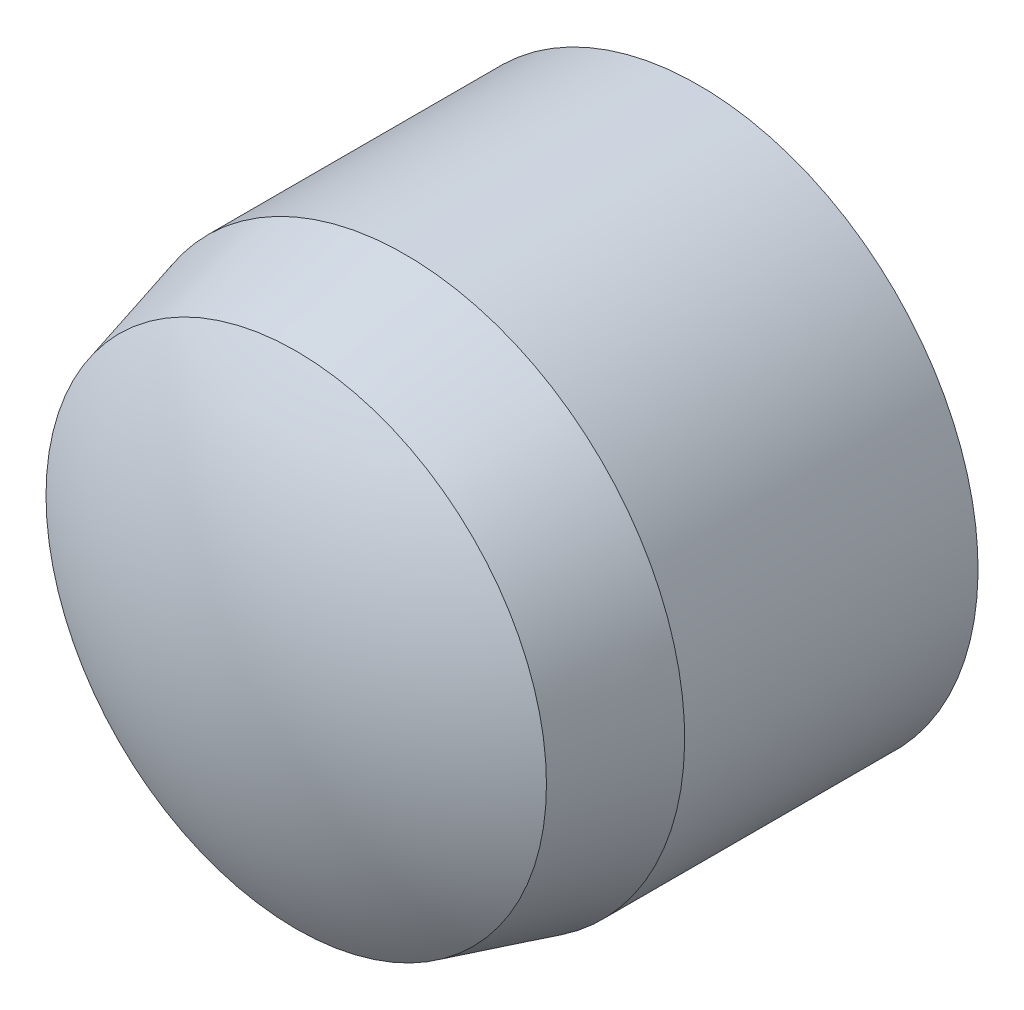
ISO-10303-21;
HEADER;
FILE_DESCRIPTION(('STEP AP214'),'2;1');
FILE_NAME('part.step','',(''),(''),'','','');
FILE_SCHEMA(('AUTOMOTIVE_DESIGN { 1 0 10303 214 1 1 1 1 }'));
ENDSEC;
DATA;
#1=APPLICATION_CONTEXT('core data for automotive mechanical design processes');
#2=APPLICATION_PROTOCOL_DEFINITION('international standard','automotive_design',2000,#1);
#3=PRODUCT_CONTEXT('',#1,'mechanical');
#4=PRODUCT('Part','Part','',(#3));
#5=PRODUCT_RELATED_PRODUCT_CATEGORY('part','',(#4));
#6=PRODUCT_DEFINITION_FORMATION('','',#4);
#7=PRODUCT_DEFINITION_CONTEXT('part definition',#1,'design');
#8=PRODUCT_DEFINITION('design','',#6,#7);
#9=PRODUCT_DEFINITION_SHAPE('','',#8);
#10=(LENGTH_UNIT() NAMED_UNIT(*) SI_UNIT(.MILLI.,.METRE.));
#11=(NAMED_UNIT(*) PLANE_ANGLE_UNIT() SI_UNIT($,.RADIAN.));
#12=(NAMED_UNIT(*) SI_UNIT($,.STERADIAN.) SOLID_ANGLE_UNIT());
#13=UNCERTAINTY_MEASURE_WITH_UNIT(LENGTH_MEASURE(1.E-05),#10,'distance_accuracy_value','');
#14=(GEOMETRIC_REPRESENTATION_CONTEXT(3) GLOBAL_UNCERTAINTY_ASSIGNED_CONTEXT((#13)) GLOBAL_UNIT_ASSIGNED_CONTEXT((#10,
#11,#12)) REPRESENTATION_CONTEXT('',''));
#15=CARTESIAN_POINT('',(0.,0.,0.));
#16=DIRECTION('',(0.,0.,1.));
#17=DIRECTION('',(1.,0.,0.));
#18=AXIS2_PLACEMENT_3D('',#15,#16,#17);
#19=CARTESIAN_POINT('',(0.,0.,2.04166666666665));
#20=DIRECTION('',(0.,0.,1.));
#21=DIRECTION('',(0.,-1.,0.));
#22=AXIS2_PLACEMENT_3D('',#19,#20,#21);
#23=SPHERICAL_SURFACE('',#22,4.54166666666665);
#24=CARTESIAN_POINT('',(0.,0.,-1.75));
#25=DIRECTION('',(0.,0.,1.));
#26=DIRECTION('',(0.,-1.,0.));
#27=AXIS2_PLACEMENT_3D('',#24,#25,#26);
#28=CIRCLE('',#27,2.5);
#29=CARTESIAN_POINT('',(0.,-2.5,-1.75));
#30=VERTEX_POINT('',#29);
#31=EDGE_CURVE('E10',#30,#30,#28,.T.);
#32=ORIENTED_EDGE('',*,*,#31,.F.);
#33=EDGE_LOOP('',(#32));
#34=FACE_BOUND('',#33,.T.);
#35=ADVANCED_FACE('F30',(#34),#23,.T.);
#36=CARTESIAN_POINT('',(0.,0.,2.5));
#37=DIRECTION('',(0.,0.,1.));
#38=DIRECTION('',(0.,-1.,0.));
#39=AXIS2_PLACEMENT_3D('',#36,#37,#38);
#40=CYLINDRICAL_SURFACE('',#39,2.5);
#41=CARTESIAN_POINT('',(0.,0.,0.875));
#42=DIRECTION('',(0.,0.,1.));
#43=DIRECTION('',(0.,-1.,0.));
#44=AXIS2_PLACEMENT_3D('',#41,#42,#43);
#45=CIRCLE('',#44,2.5);
#46=CARTESIAN_POINT('',(0.,-2.5,0.874999999999999));
#47=VERTEX_POINT('',#46);
#48=EDGE_CURVE('E36',#47,#47,#45,.T.);
#49=ORIENTED_EDGE('',*,*,#48,.F.);
#50=EDGE_LOOP('',(#49));
#51=FACE_BOUND('',#50,.T.);
#52=ORIENTED_EDGE('',*,*,#31,.T.);
#53=EDGE_LOOP('',(#52));
#54=FACE_BOUND('',#53,.T.);
#55=ADVANCED_FACE('F51',(#51,#54),#40,.T.);
#56=CARTESIAN_POINT('',(0.,0.,0.875));
#57=DIRECTION('',(0.,0.,-1.));
#58=DIRECTION('',(0.,1.,0.));
#59=AXIS2_PLACEMENT_3D('',#56,#57,#58);
#60=CONICAL_SURFACE('',#59,2.5,0.26179938779915);
#61=CARTESIAN_POINT('',(0.,0.,1.85));
#62=DIRECTION('',(0.,0.,1.));
#63=DIRECTION('',(0.,-1.,0.));
#64=AXIS2_PLACEMENT_3D('',#61,#62,#63);
#65=CIRCLE('',#64,2.23874953737965);
#66=CARTESIAN_POINT('',(0.,-2.23874953737965,1.85));
#67=VERTEX_POINT('',#66);
#68=EDGE_CURVE('E40',#67,#67,#65,.T.);
#69=ORIENTED_EDGE('',*,*,#68,.F.);
#70=EDGE_LOOP('',(#69));
#71=FACE_BOUND('',#70,.T.);
#72=ORIENTED_EDGE('',*,*,#48,.T.);
#73=EDGE_LOOP('',(#72));
#74=FACE_BOUND('',#73,.T.);
#75=ADVANCED_FACE('F49',(#71,#74),#60,.T.);
#76=CARTESIAN_POINT('',(0.,0.,-1.68038422393663));
#77=DIRECTION('',(0.,0.,1.));
#78=DIRECTION('',(0.,1.,0.));
#79=AXIS2_PLACEMENT_3D('',#76,#77,#78);
#80=SPHERICAL_SURFACE('',#79,4.18038422393663);
#81=ORIENTED_EDGE('',*,*,#68,.T.);
#82=EDGE_LOOP('',(#81));
#83=FACE_BOUND('',#82,.T.);
#84=ADVANCED_FACE('F47',(#83),#80,.T.);
#85=CLOSED_SHELL('',(#35,#55,#75,#84));
#86=MANIFOLD_SOLID_BREP('B2',#85);
#87=ADVANCED_BREP_SHAPE_REPRESENTATION('',(#18,#86),#14);
#88=SHAPE_DEFINITION_REPRESENTATION(#9,#87);
ENDSEC;
END-ISO-10303-21;
